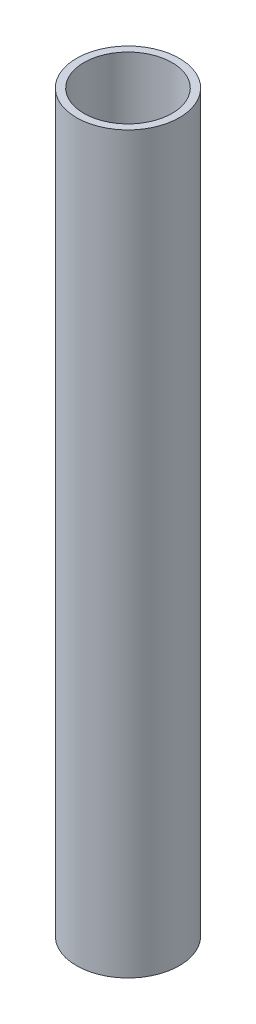
ISO-10303-21;
HEADER;
FILE_DESCRIPTION(('STEP AP214'),'2;1');
FILE_NAME('part.step','',(''),(''),'','','');
FILE_SCHEMA(('AUTOMOTIVE_DESIGN { 1 0 10303 214 1 1 1 1 }'));
ENDSEC;
DATA;
#1=APPLICATION_CONTEXT('core data for automotive mechanical design processes');
#2=APPLICATION_PROTOCOL_DEFINITION('international standard','automotive_design',2000,#1);
#3=PRODUCT_CONTEXT('',#1,'mechanical');
#4=PRODUCT('Part','Part','',(#3));
#5=PRODUCT_RELATED_PRODUCT_CATEGORY('part','',(#4));
#6=PRODUCT_DEFINITION_FORMATION('','',#4);
#7=PRODUCT_DEFINITION_CONTEXT('part definition',#1,'design');
#8=PRODUCT_DEFINITION('design','',#6,#7);
#9=PRODUCT_DEFINITION_SHAPE('','',#8);
#10=(LENGTH_UNIT() NAMED_UNIT(*) SI_UNIT(.MILLI.,.METRE.));
#11=(NAMED_UNIT(*) PLANE_ANGLE_UNIT() SI_UNIT($,.RADIAN.));
#12=(NAMED_UNIT(*) SI_UNIT($,.STERADIAN.) SOLID_ANGLE_UNIT());
#13=UNCERTAINTY_MEASURE_WITH_UNIT(LENGTH_MEASURE(1.E-05),#10,'distance_accuracy_value','');
#14=(GEOMETRIC_REPRESENTATION_CONTEXT(3) GLOBAL_UNCERTAINTY_ASSIGNED_CONTEXT((#13)) GLOBAL_UNIT_ASSIGNED_CONTEXT((#10,
#11,#12)) REPRESENTATION_CONTEXT('',''));
#15=CARTESIAN_POINT('',(0.,0.,0.));
#16=DIRECTION('',(0.,0.,1.));
#17=DIRECTION('',(1.,0.,0.));
#18=AXIS2_PLACEMENT_3D('',#15,#16,#17);
#19=CARTESIAN_POINT('',(0.,25.,0.));
#20=DIRECTION('',(0.,1.,0.));
#21=DIRECTION('',(0.,0.,1.));
#22=AXIS2_PLACEMENT_3D('',#19,#20,#21);
#23=PLANE('',#22);
#24=CARTESIAN_POINT('',(0.,25.,0.));
#25=DIRECTION('',(0.,1.,0.));
#26=DIRECTION('',(0.,0.,1.));
#27=AXIS2_PLACEMENT_3D('',#24,#25,#26);
#28=CIRCLE('',#27,3.5);
#29=CARTESIAN_POINT('',(0.,25.,3.5));
#30=VERTEX_POINT('',#29);
#31=EDGE_CURVE('E10',#30,#30,#28,.T.);
#32=ORIENTED_EDGE('',*,*,#31,.T.);
#33=EDGE_LOOP('',(#32));
#34=FACE_BOUND('',#33,.T.);
#35=CARTESIAN_POINT('',(0.,25.,0.));
#36=DIRECTION('',(0.,1.,0.));
#37=DIRECTION('',(0.,0.,1.));
#38=AXIS2_PLACEMENT_3D('',#35,#36,#37);
#39=CIRCLE('',#38,3.);
#40=CARTESIAN_POINT('',(0.,25.,3.));
#41=VERTEX_POINT('',#40);
#42=EDGE_CURVE('E56',#41,#41,#39,.T.);
#43=ORIENTED_EDGE('',*,*,#42,.F.);
#44=EDGE_LOOP('',(#43));
#45=FACE_BOUND('',#44,.T.);
#46=ADVANCED_FACE('F43',(#34,#45),#23,.T.);
#47=CARTESIAN_POINT('',(0.,-25.,0.));
#48=DIRECTION('',(0.,1.,0.));
#49=DIRECTION('',(0.,0.,1.));
#50=AXIS2_PLACEMENT_3D('',#47,#48,#49);
#51=PLANE('',#50);
#52=CARTESIAN_POINT('',(0.,-25.,0.));
#53=DIRECTION('',(0.,1.,0.));
#54=DIRECTION('',(0.,0.,1.));
#55=AXIS2_PLACEMENT_3D('',#52,#53,#54);
#56=CIRCLE('',#55,3.5);
#57=CARTESIAN_POINT('',(0.,-25.,3.5));
#58=VERTEX_POINT('',#57);
#59=EDGE_CURVE('E47',#58,#58,#56,.T.);
#60=ORIENTED_EDGE('',*,*,#59,.F.);
#61=EDGE_LOOP('',(#60));
#62=FACE_BOUND('',#61,.T.);
#63=CARTESIAN_POINT('',(0.,-25.,0.));
#64=DIRECTION('',(0.,1.,0.));
#65=DIRECTION('',(0.,0.,1.));
#66=AXIS2_PLACEMENT_3D('',#63,#64,#65);
#67=CIRCLE('',#66,3.);
#68=CARTESIAN_POINT('',(0.,-25.,3.));
#69=VERTEX_POINT('',#68);
#70=EDGE_CURVE('E58',#69,#69,#67,.T.);
#71=ORIENTED_EDGE('',*,*,#70,.T.);
#72=EDGE_LOOP('',(#71));
#73=FACE_BOUND('',#72,.T.);
#74=ADVANCED_FACE('F70',(#62,#73),#51,.F.);
#75=CARTESIAN_POINT('',(0.,25.,0.));
#76=DIRECTION('',(0.,-1.,0.));
#77=DIRECTION('',(0.,0.,-1.));
#78=AXIS2_PLACEMENT_3D('',#75,#76,#77);
#79=CYLINDRICAL_SURFACE('',#78,3.5);
#80=ORIENTED_EDGE('',*,*,#31,.F.);
#81=EDGE_LOOP('',(#80));
#82=FACE_BOUND('',#81,.T.);
#83=ORIENTED_EDGE('',*,*,#59,.T.);
#84=EDGE_LOOP('',(#83));
#85=FACE_BOUND('',#84,.T.);
#86=ADVANCED_FACE('F45',(#82,#85),#79,.T.);
#87=CARTESIAN_POINT('',(0.,25.,0.));
#88=DIRECTION('',(0.,-1.,0.));
#89=DIRECTION('',(0.,0.,-1.));
#90=AXIS2_PLACEMENT_3D('',#87,#88,#89);
#91=CYLINDRICAL_SURFACE('',#90,3.);
#92=ORIENTED_EDGE('',*,*,#42,.T.);
#93=EDGE_LOOP('',(#92));
#94=FACE_BOUND('',#93,.T.);
#95=ORIENTED_EDGE('',*,*,#70,.F.);
#96=EDGE_LOOP('',(#95));
#97=FACE_BOUND('',#96,.T.);
#98=ADVANCED_FACE('F66',(#94,#97),#91,.F.);
#99=CLOSED_SHELL('',(#46,#74,#86,#98));
#100=MANIFOLD_SOLID_BREP('B2',#99);
#101=ADVANCED_BREP_SHAPE_REPRESENTATION('',(#18,#100),#14);
#102=SHAPE_DEFINITION_REPRESENTATION(#9,#101);
ENDSEC;
END-ISO-10303-21;
